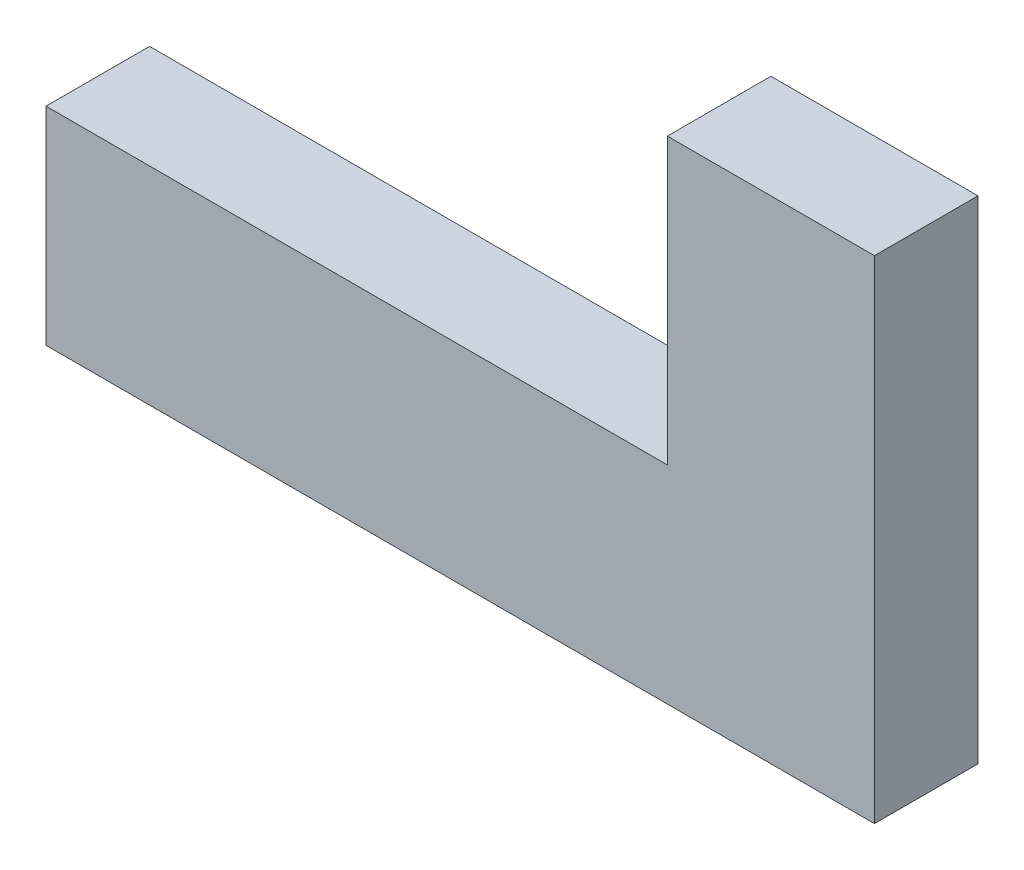
ISO-10303-21;
HEADER;
FILE_DESCRIPTION(('STEP AP214'),'2;1');
FILE_NAME('part.step','',(''),(''),'','','');
FILE_SCHEMA(('AUTOMOTIVE_DESIGN { 1 0 10303 214 1 1 1 1 }'));
ENDSEC;
DATA;
#1=APPLICATION_CONTEXT('core data for automotive mechanical design processes');
#2=APPLICATION_PROTOCOL_DEFINITION('international standard','automotive_design',2000,#1);
#3=PRODUCT_CONTEXT('',#1,'mechanical');
#4=PRODUCT('Part','Part','',(#3));
#5=PRODUCT_RELATED_PRODUCT_CATEGORY('part','',(#4));
#6=PRODUCT_DEFINITION_FORMATION('','',#4);
#7=PRODUCT_DEFINITION_CONTEXT('part definition',#1,'design');
#8=PRODUCT_DEFINITION('design','',#6,#7);
#9=PRODUCT_DEFINITION_SHAPE('','',#8);
#10=(LENGTH_UNIT() NAMED_UNIT(*) SI_UNIT(.MILLI.,.METRE.));
#11=(NAMED_UNIT(*) PLANE_ANGLE_UNIT() SI_UNIT($,.RADIAN.));
#12=(NAMED_UNIT(*) SI_UNIT($,.STERADIAN.) SOLID_ANGLE_UNIT());
#13=UNCERTAINTY_MEASURE_WITH_UNIT(LENGTH_MEASURE(1.E-05),#10,'distance_accuracy_value','');
#14=(GEOMETRIC_REPRESENTATION_CONTEXT(3) GLOBAL_UNCERTAINTY_ASSIGNED_CONTEXT((#13)) GLOBAL_UNIT_ASSIGNED_CONTEXT((#10,
#11,#12)) REPRESENTATION_CONTEXT('',''));
#15=CARTESIAN_POINT('',(0.,0.,0.));
#16=DIRECTION('',(0.,0.,1.));
#17=DIRECTION('',(1.,0.,0.));
#18=AXIS2_PLACEMENT_3D('',#15,#16,#17);
#19=CARTESIAN_POINT('',(0.,0.,5.08));
#20=DIRECTION('',(1.,0.,0.));
#21=DIRECTION('',(0.,0.,-1.));
#22=AXIS2_PLACEMENT_3D('',#19,#20,#21);
#23=PLANE('',#22);
#24=DIRECTION('',(0.,-1.,0.));
#25=VECTOR('',#24,1.);
#26=CARTESIAN_POINT('',(0.,0.,0.));
#27=LINE('',#26,#25);
#28=CARTESIAN_POINT('',(0.,10.16,0.));
#29=VERTEX_POINT('',#28);
#30=CARTESIAN_POINT('',(0.,0.,0.));
#31=VERTEX_POINT('',#30);
#32=EDGE_CURVE('E117',#29,#31,#27,.T.);
#33=ORIENTED_EDGE('',*,*,#32,.T.);
#34=DIRECTION('',(0.,0.,-1.));
#35=VECTOR('',#34,1.);
#36=CARTESIAN_POINT('',(0.,0.,5.08));
#37=LINE('',#36,#35);
#38=CARTESIAN_POINT('',(0.,0.,5.08));
#39=VERTEX_POINT('',#38);
#40=EDGE_CURVE('E11',#39,#31,#37,.T.);
#41=ORIENTED_EDGE('',*,*,#40,.F.);
#42=DIRECTION('',(0.,-1.,0.));
#43=VECTOR('',#42,1.);
#44=CARTESIAN_POINT('',(0.,0.,5.08));
#45=LINE('',#44,#43);
#46=CARTESIAN_POINT('',(0.,10.16,5.08));
#47=VERTEX_POINT('',#46);
#48=EDGE_CURVE('E128',#47,#39,#45,.T.);
#49=ORIENTED_EDGE('',*,*,#48,.F.);
#50=DIRECTION('',(0.,0.,-1.));
#51=VECTOR('',#50,1.);
#52=CARTESIAN_POINT('',(0.,10.16,5.08));
#53=LINE('',#52,#51);
#54=EDGE_CURVE('E113',#47,#29,#53,.T.);
#55=ORIENTED_EDGE('',*,*,#54,.T.);
#56=EDGE_LOOP('',(#33,#41,#49,#55));
#57=FACE_BOUND('',#56,.T.);
#58=ADVANCED_FACE('F33',(#57),#23,.F.);
#59=CARTESIAN_POINT('',(0.,0.,5.08));
#60=DIRECTION('',(0.,1.,0.));
#61=DIRECTION('',(0.,0.,1.));
#62=AXIS2_PLACEMENT_3D('',#59,#60,#61);
#63=PLANE('',#62);
#64=DIRECTION('',(1.,0.,0.));
#65=VECTOR('',#64,1.);
#66=CARTESIAN_POINT('',(0.,0.,0.));
#67=LINE('',#66,#65);
#68=CARTESIAN_POINT('',(40.64,0.,0.));
#69=VERTEX_POINT('',#68);
#70=EDGE_CURVE('E120',#31,#69,#67,.T.);
#71=ORIENTED_EDGE('',*,*,#70,.T.);
#72=DIRECTION('',(0.,0.,-1.));
#73=VECTOR('',#72,1.);
#74=CARTESIAN_POINT('',(40.64,0.,5.08));
#75=LINE('',#74,#73);
#76=CARTESIAN_POINT('',(40.64,0.,5.08));
#77=VERTEX_POINT('',#76);
#78=EDGE_CURVE('E41',#77,#69,#75,.T.);
#79=ORIENTED_EDGE('',*,*,#78,.F.);
#80=DIRECTION('',(1.,0.,0.));
#81=VECTOR('',#80,1.);
#82=CARTESIAN_POINT('',(0.,0.,5.08));
#83=LINE('',#82,#81);
#84=EDGE_CURVE('E86',#39,#77,#83,.T.);
#85=ORIENTED_EDGE('',*,*,#84,.F.);
#86=ORIENTED_EDGE('',*,*,#40,.T.);
#87=EDGE_LOOP('',(#71,#79,#85,#86));
#88=FACE_BOUND('',#87,.T.);
#89=ADVANCED_FACE('F134',(#88),#63,.F.);
#90=CARTESIAN_POINT('',(40.64,10.16,5.08));
#91=DIRECTION('',(-1.,0.,0.));
#92=DIRECTION('',(0.,0.,1.));
#93=AXIS2_PLACEMENT_3D('',#90,#91,#92);
#94=PLANE('',#93);
#95=DIRECTION('',(0.,1.,0.));
#96=VECTOR('',#95,1.);
#97=CARTESIAN_POINT('',(40.64,10.16,0.));
#98=LINE('',#97,#96);
#99=CARTESIAN_POINT('',(40.64,24.13,0.));
#100=VERTEX_POINT('',#99);
#101=EDGE_CURVE('E123',#69,#100,#98,.T.);
#102=ORIENTED_EDGE('',*,*,#101,.T.);
#103=DIRECTION('',(0.,0.,-1.));
#104=VECTOR('',#103,1.);
#105=CARTESIAN_POINT('',(40.64,24.13,5.08));
#106=LINE('',#105,#104);
#107=CARTESIAN_POINT('',(40.64,24.13,5.08));
#108=VERTEX_POINT('',#107);
#109=EDGE_CURVE('E108',#108,#100,#106,.T.);
#110=ORIENTED_EDGE('',*,*,#109,.F.);
#111=DIRECTION('',(0.,1.,0.));
#112=VECTOR('',#111,1.);
#113=CARTESIAN_POINT('',(40.64,0.,5.08));
#114=LINE('',#113,#112);
#115=EDGE_CURVE('E99',#77,#108,#114,.T.);
#116=ORIENTED_EDGE('',*,*,#115,.F.);
#117=ORIENTED_EDGE('',*,*,#78,.T.);
#118=EDGE_LOOP('',(#102,#110,#116,#117));
#119=FACE_BOUND('',#118,.T.);
#120=ADVANCED_FACE('F133',(#119),#94,.F.);
#121=CARTESIAN_POINT('',(40.64,24.13,5.08));
#122=DIRECTION('',(0.,-1.,0.));
#123=DIRECTION('',(0.,0.,-1.));
#124=AXIS2_PLACEMENT_3D('',#121,#122,#123);
#125=PLANE('',#124);
#126=DIRECTION('',(-1.,0.,0.));
#127=VECTOR('',#126,1.);
#128=CARTESIAN_POINT('',(40.64,24.13,0.));
#129=LINE('',#128,#127);
#130=CARTESIAN_POINT('',(30.48,24.13,0.));
#131=VERTEX_POINT('',#130);
#132=EDGE_CURVE('E107',#100,#131,#129,.T.);
#133=ORIENTED_EDGE('',*,*,#132,.T.);
#134=DIRECTION('',(0.,0.,-1.));
#135=VECTOR('',#134,1.);
#136=CARTESIAN_POINT('',(30.48,24.13,5.08));
#137=LINE('',#136,#135);
#138=CARTESIAN_POINT('',(30.48,24.13,5.08));
#139=VERTEX_POINT('',#138);
#140=EDGE_CURVE('E104',#139,#131,#137,.T.);
#141=ORIENTED_EDGE('',*,*,#140,.F.);
#142=DIRECTION('',(-1.,0.,0.));
#143=VECTOR('',#142,1.);
#144=CARTESIAN_POINT('',(40.64,24.13,5.08));
#145=LINE('',#144,#143);
#146=EDGE_CURVE('E93',#108,#139,#145,.T.);
#147=ORIENTED_EDGE('',*,*,#146,.F.);
#148=ORIENTED_EDGE('',*,*,#109,.T.);
#149=EDGE_LOOP('',(#133,#141,#147,#148));
#150=FACE_BOUND('',#149,.T.);
#151=ADVANCED_FACE('F105',(#150),#125,.F.);
#152=CARTESIAN_POINT('',(30.48,10.16,5.08));
#153=DIRECTION('',(1.,0.,0.));
#154=DIRECTION('',(0.,0.,-1.));
#155=AXIS2_PLACEMENT_3D('',#152,#153,#154);
#156=PLANE('',#155);
#157=DIRECTION('',(0.,-1.,0.));
#158=VECTOR('',#157,1.);
#159=CARTESIAN_POINT('',(30.48,10.16,0.));
#160=LINE('',#159,#158);
#161=CARTESIAN_POINT('',(30.48,10.16,0.));
#162=VERTEX_POINT('',#161);
#163=EDGE_CURVE('E72',#131,#162,#160,.T.);
#164=ORIENTED_EDGE('',*,*,#163,.T.);
#165=DIRECTION('',(0.,0.,-1.));
#166=VECTOR('',#165,1.);
#167=CARTESIAN_POINT('',(30.48,10.16,5.08));
#168=LINE('',#167,#166);
#169=CARTESIAN_POINT('',(30.48,10.16,5.08));
#170=VERTEX_POINT('',#169);
#171=EDGE_CURVE('E109',#170,#162,#168,.T.);
#172=ORIENTED_EDGE('',*,*,#171,.F.);
#173=DIRECTION('',(0.,-1.,0.));
#174=VECTOR('',#173,1.);
#175=CARTESIAN_POINT('',(30.48,10.16,5.08));
#176=LINE('',#175,#174);
#177=EDGE_CURVE('E97',#139,#170,#176,.T.);
#178=ORIENTED_EDGE('',*,*,#177,.F.);
#179=ORIENTED_EDGE('',*,*,#140,.T.);
#180=EDGE_LOOP('',(#164,#172,#178,#179));
#181=FACE_BOUND('',#180,.T.);
#182=ADVANCED_FACE('F111',(#181),#156,.F.);
#183=CARTESIAN_POINT('',(0.,10.16,5.08));
#184=DIRECTION('',(0.,-1.,0.));
#185=DIRECTION('',(1.,0.,0.));
#186=AXIS2_PLACEMENT_3D('',#183,#184,#185);
#187=PLANE('',#186);
#188=DIRECTION('',(-1.,0.,0.));
#189=VECTOR('',#188,1.);
#190=CARTESIAN_POINT('',(0.,10.16,0.));
#191=LINE('',#190,#189);
#192=EDGE_CURVE('E78',#162,#29,#191,.T.);
#193=ORIENTED_EDGE('',*,*,#192,.T.);
#194=ORIENTED_EDGE('',*,*,#54,.F.);
#195=DIRECTION('',(-1.,0.,0.));
#196=VECTOR('',#195,1.);
#197=CARTESIAN_POINT('',(0.,10.16,5.08));
#198=LINE('',#197,#196);
#199=EDGE_CURVE('E49',#170,#47,#198,.T.);
#200=ORIENTED_EDGE('',*,*,#199,.F.);
#201=ORIENTED_EDGE('',*,*,#171,.T.);
#202=EDGE_LOOP('',(#193,#194,#200,#201));
#203=FACE_BOUND('',#202,.T.);
#204=ADVANCED_FACE('F141',(#203),#187,.F.);
#205=CARTESIAN_POINT('',(0.,0.,5.08));
#206=DIRECTION('',(0.,0.,-1.));
#207=DIRECTION('',(-1.,0.,0.));
#208=AXIS2_PLACEMENT_3D('',#205,#206,#207);
#209=PLANE('',#208);
#210=ORIENTED_EDGE('',*,*,#48,.T.);
#211=ORIENTED_EDGE('',*,*,#84,.T.);
#212=ORIENTED_EDGE('',*,*,#115,.T.);
#213=ORIENTED_EDGE('',*,*,#146,.T.);
#214=ORIENTED_EDGE('',*,*,#177,.T.);
#215=ORIENTED_EDGE('',*,*,#199,.T.);
#216=EDGE_LOOP('',(#210,#211,#212,#213,#214,#215));
#217=FACE_BOUND('',#216,.T.);
#218=ADVANCED_FACE('F95',(#217),#209,.F.);
#219=CARTESIAN_POINT('',(0.,0.,0.));
#220=DIRECTION('',(0.,0.,-1.));
#221=DIRECTION('',(-1.,0.,0.));
#222=AXIS2_PLACEMENT_3D('',#219,#220,#221);
#223=PLANE('',#222);
#224=ORIENTED_EDGE('',*,*,#32,.F.);
#225=ORIENTED_EDGE('',*,*,#192,.F.);
#226=ORIENTED_EDGE('',*,*,#163,.F.);
#227=ORIENTED_EDGE('',*,*,#132,.F.);
#228=ORIENTED_EDGE('',*,*,#101,.F.);
#229=ORIENTED_EDGE('',*,*,#70,.F.);
#230=EDGE_LOOP('',(#224,#225,#226,#227,#228,#229));
#231=FACE_BOUND('',#230,.T.);
#232=ADVANCED_FACE('F138',(#231),#223,.T.);
#233=CLOSED_SHELL('',(#58,#89,#120,#151,#182,#204,#218,#232));
#234=MANIFOLD_SOLID_BREP('B2',#233);
#235=ADVANCED_BREP_SHAPE_REPRESENTATION('',(#18,#234),#14);
#236=SHAPE_DEFINITION_REPRESENTATION(#9,#235);
ENDSEC;
END-ISO-10303-21;
